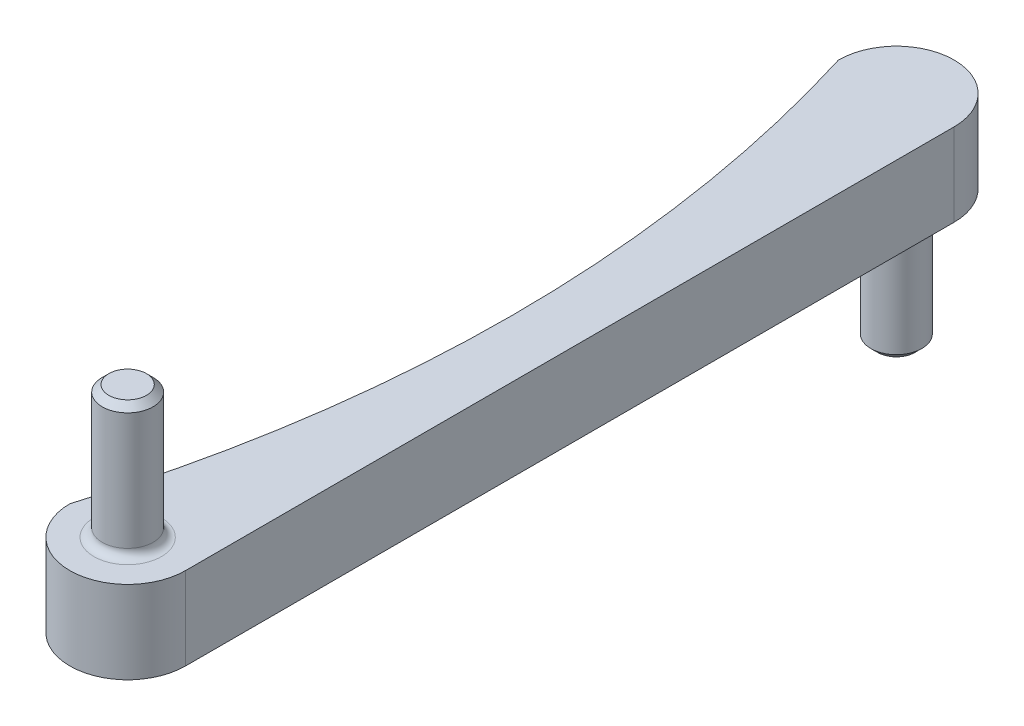
ISO-10303-21;
HEADER;
FILE_DESCRIPTION(('STEP AP214'),'2;1');
FILE_NAME('part.step','',(''),(''),'','','');
FILE_SCHEMA(('AUTOMOTIVE_DESIGN { 1 0 10303 214 1 1 1 1 }'));
ENDSEC;
DATA;
#1=APPLICATION_CONTEXT('core data for automotive mechanical design processes');
#2=APPLICATION_PROTOCOL_DEFINITION('international standard','automotive_design',2000,#1);
#3=PRODUCT_CONTEXT('',#1,'mechanical');
#4=PRODUCT('Part','Part','',(#3));
#5=PRODUCT_RELATED_PRODUCT_CATEGORY('part','',(#4));
#6=PRODUCT_DEFINITION_FORMATION('','',#4);
#7=PRODUCT_DEFINITION_CONTEXT('part definition',#1,'design');
#8=PRODUCT_DEFINITION('design','',#6,#7);
#9=PRODUCT_DEFINITION_SHAPE('','',#8);
#10=(LENGTH_UNIT() NAMED_UNIT(*) SI_UNIT(.MILLI.,.METRE.));
#11=(NAMED_UNIT(*) PLANE_ANGLE_UNIT() SI_UNIT($,.RADIAN.));
#12=(NAMED_UNIT(*) SI_UNIT($,.STERADIAN.) SOLID_ANGLE_UNIT());
#13=UNCERTAINTY_MEASURE_WITH_UNIT(LENGTH_MEASURE(1.E-05),#10,'distance_accuracy_value','');
#14=(GEOMETRIC_REPRESENTATION_CONTEXT(3) GLOBAL_UNCERTAINTY_ASSIGNED_CONTEXT((#13)) GLOBAL_UNIT_ASSIGNED_CONTEXT((#10,
#11,#12)) REPRESENTATION_CONTEXT('',''));
#15=CARTESIAN_POINT('',(0.,0.,0.));
#16=DIRECTION('',(0.,0.,1.));
#17=DIRECTION('',(1.,0.,0.));
#18=AXIS2_PLACEMENT_3D('',#15,#16,#17);
#19=CARTESIAN_POINT('',(0.,6.35,0.));
#20=DIRECTION('',(0.,-1.,0.));
#21=DIRECTION('',(0.,0.,-1.));
#22=AXIS2_PLACEMENT_3D('',#19,#20,#21);
#23=CYLINDRICAL_SURFACE('',#22,4.445);
#24=CARTESIAN_POINT('',(0.,0.,0.));
#25=DIRECTION('',(0.,1.,0.));
#26=DIRECTION('',(0.,0.,1.));
#27=AXIS2_PLACEMENT_3D('',#24,#25,#26);
#28=CIRCLE('',#27,4.445);
#29=CARTESIAN_POINT('',(-4.445,0.,0.));
#30=VERTEX_POINT('',#29);
#31=CARTESIAN_POINT('',(4.445,0.,0.));
#32=VERTEX_POINT('',#31);
#33=EDGE_CURVE('E107',#30,#32,#28,.T.);
#34=ORIENTED_EDGE('',*,*,#33,.T.);
#35=DIRECTION('',(0.,-1.,0.));
#36=VECTOR('',#35,1.);
#37=CARTESIAN_POINT('',(4.445,6.35,0.));
#38=LINE('',#37,#36);
#39=CARTESIAN_POINT('',(4.445,6.35,0.));
#40=VERTEX_POINT('',#39);
#41=EDGE_CURVE('E110',#40,#32,#38,.T.);
#42=ORIENTED_EDGE('',*,*,#41,.F.);
#43=CARTESIAN_POINT('',(0.,6.35,0.));
#44=DIRECTION('',(0.,1.,0.));
#45=DIRECTION('',(0.,0.,1.));
#46=AXIS2_PLACEMENT_3D('',#43,#44,#45);
#47=CIRCLE('',#46,4.445);
#48=CARTESIAN_POINT('',(-4.445,6.35,0.));
#49=VERTEX_POINT('',#48);
#50=EDGE_CURVE('E114',#49,#40,#47,.T.);
#51=ORIENTED_EDGE('',*,*,#50,.F.);
#52=DIRECTION('',(0.,-1.,0.));
#53=VECTOR('',#52,1.);
#54=CARTESIAN_POINT('',(-4.445,6.35,0.));
#55=LINE('',#54,#53);
#56=EDGE_CURVE('E99',#49,#30,#55,.T.);
#57=ORIENTED_EDGE('',*,*,#56,.T.);
#58=EDGE_LOOP('',(#34,#42,#51,#57));
#59=FACE_BOUND('',#58,.T.);
#60=ADVANCED_FACE('F47',(#59),#23,.T.);
#61=CARTESIAN_POINT('',(4.445,6.35,0.));
#62=DIRECTION('',(-1.,0.,0.));
#63=DIRECTION('',(0.,0.,1.));
#64=AXIS2_PLACEMENT_3D('',#61,#62,#63);
#65=PLANE('',#64);
#66=DIRECTION('',(0.,0.,-1.));
#67=VECTOR('',#66,1.);
#68=CARTESIAN_POINT('',(4.445,0.,0.));
#69=LINE('',#68,#67);
#70=CARTESIAN_POINT('',(4.445,0.,-59.055));
#71=VERTEX_POINT('',#70);
#72=EDGE_CURVE('E78',#32,#71,#69,.T.);
#73=ORIENTED_EDGE('',*,*,#72,.T.);
#74=DIRECTION('',(0.,-1.,0.));
#75=VECTOR('',#74,1.);
#76=CARTESIAN_POINT('',(4.445,6.35,-59.055));
#77=LINE('',#76,#75);
#78=CARTESIAN_POINT('',(4.445,6.35,-59.055));
#79=VERTEX_POINT('',#78);
#80=EDGE_CURVE('E98',#79,#71,#77,.T.);
#81=ORIENTED_EDGE('',*,*,#80,.F.);
#82=DIRECTION('',(0.,0.,-1.));
#83=VECTOR('',#82,1.);
#84=CARTESIAN_POINT('',(4.445,6.35,0.));
#85=LINE('',#84,#83);
#86=EDGE_CURVE('E66',#40,#79,#85,.T.);
#87=ORIENTED_EDGE('',*,*,#86,.F.);
#88=ORIENTED_EDGE('',*,*,#41,.T.);
#89=EDGE_LOOP('',(#73,#81,#87,#88));
#90=FACE_BOUND('',#89,.T.);
#91=ADVANCED_FACE('F167',(#90),#65,.F.);
#92=CARTESIAN_POINT('',(0.,6.35,-59.055));
#93=DIRECTION('',(0.,-1.,0.));
#94=DIRECTION('',(0.,0.,-1.));
#95=AXIS2_PLACEMENT_3D('',#92,#93,#94);
#96=CYLINDRICAL_SURFACE('',#95,4.445);
#97=CARTESIAN_POINT('',(0.,0.,-59.055));
#98=DIRECTION('',(0.,1.,0.));
#99=DIRECTION('',(0.,0.,1.));
#100=AXIS2_PLACEMENT_3D('',#97,#98,#99);
#101=CIRCLE('',#100,4.445);
#102=CARTESIAN_POINT('',(-4.445,0.,-59.055));
#103=VERTEX_POINT('',#102);
#104=EDGE_CURVE('E105',#71,#103,#101,.T.);
#105=ORIENTED_EDGE('',*,*,#104,.T.);
#106=DIRECTION('',(0.,-1.,0.));
#107=VECTOR('',#106,1.);
#108=CARTESIAN_POINT('',(-4.445,6.35,-59.055));
#109=LINE('',#108,#107);
#110=CARTESIAN_POINT('',(-4.445,6.35,-59.055));
#111=VERTEX_POINT('',#110);
#112=EDGE_CURVE('E85',#111,#103,#109,.T.);
#113=ORIENTED_EDGE('',*,*,#112,.F.);
#114=CARTESIAN_POINT('',(0.,6.35,-59.055));
#115=DIRECTION('',(0.,1.,0.));
#116=DIRECTION('',(0.,0.,1.));
#117=AXIS2_PLACEMENT_3D('',#114,#115,#116);
#118=CIRCLE('',#117,4.445);
#119=EDGE_CURVE('E123',#79,#111,#118,.T.);
#120=ORIENTED_EDGE('',*,*,#119,.F.);
#121=ORIENTED_EDGE('',*,*,#80,.T.);
#122=EDGE_LOOP('',(#105,#113,#120,#121));
#123=FACE_BOUND('',#122,.T.);
#124=ADVANCED_FACE('F112',(#123),#96,.T.);
#125=CARTESIAN_POINT('',(0.,6.35,0.));
#126=DIRECTION('',(0.,1.,0.));
#127=DIRECTION('',(0.,0.,1.));
#128=AXIS2_PLACEMENT_3D('',#125,#126,#127);
#129=PLANE('',#128);
#130=CARTESIAN_POINT('',(0.,6.35,0.));
#131=DIRECTION('',(0.,1.,0.));
#132=DIRECTION('',(0.,0.,1.));
#133=AXIS2_PLACEMENT_3D('',#130,#131,#132);
#134=CIRCLE('',#133,2.5908);
#135=CARTESIAN_POINT('',(0.,6.35,2.5908));
#136=VERTEX_POINT('',#135);
#137=EDGE_CURVE('E140',#136,#136,#134,.F.);
#138=ORIENTED_EDGE('',*,*,#137,.T.);
#139=EDGE_LOOP('',(#138));
#140=FACE_BOUND('',#139,.T.);
#141=CARTESIAN_POINT('',(-99.9443945089841,6.35,-29.5275));
#142=DIRECTION('',(0.,1.,0.));
#143=DIRECTION('',(0.,0.,-1.));
#144=AXIS2_PLACEMENT_3D('',#141,#142,#143);
#145=CIRCLE('',#144,99.9600300511788);
#146=EDGE_CURVE('E93',#49,#111,#145,.T.);
#147=ORIENTED_EDGE('',*,*,#146,.F.);
#148=ORIENTED_EDGE('',*,*,#50,.T.);
#149=ORIENTED_EDGE('',*,*,#86,.T.);
#150=ORIENTED_EDGE('',*,*,#119,.T.);
#151=EDGE_LOOP('',(#147,#148,#149,#150));
#152=FACE_BOUND('',#151,.T.);
#153=ADVANCED_FACE('F206',(#140,#152),#129,.T.);
#154=CARTESIAN_POINT('',(0.,0.,0.));
#155=DIRECTION('',(0.,1.,0.));
#156=DIRECTION('',(0.,0.,1.));
#157=AXIS2_PLACEMENT_3D('',#154,#155,#156);
#158=PLANE('',#157);
#159=CARTESIAN_POINT('',(0.,0.,-59.055));
#160=DIRECTION('',(0.,1.,0.));
#161=DIRECTION('',(0.,0.,1.));
#162=AXIS2_PLACEMENT_3D('',#159,#160,#161);
#163=CIRCLE('',#162,2.5908);
#164=CARTESIAN_POINT('',(0.,0.,-56.4642));
#165=VERTEX_POINT('',#164);
#166=EDGE_CURVE('E132',#165,#165,#163,.T.);
#167=ORIENTED_EDGE('',*,*,#166,.T.);
#168=EDGE_LOOP('',(#167));
#169=FACE_BOUND('',#168,.T.);
#170=ORIENTED_EDGE('',*,*,#33,.F.);
#171=CARTESIAN_POINT('',(-99.9443945089841,0.,-29.5275));
#172=DIRECTION('',(0.,1.,0.));
#173=DIRECTION('',(0.,0.,1.));
#174=AXIS2_PLACEMENT_3D('',#171,#172,#173);
#175=CIRCLE('',#174,99.9600300511788);
#176=EDGE_CURVE('E89',#30,#103,#175,.T.);
#177=ORIENTED_EDGE('',*,*,#176,.T.);
#178=ORIENTED_EDGE('',*,*,#104,.F.);
#179=ORIENTED_EDGE('',*,*,#72,.F.);
#180=EDGE_LOOP('',(#170,#177,#178,#179));
#181=FACE_BOUND('',#180,.T.);
#182=ADVANCED_FACE('F104',(#169,#181),#158,.F.);
#183=CARTESIAN_POINT('',(0.,16.51,0.));
#184=DIRECTION('',(0.,-1.,0.));
#185=DIRECTION('',(0.,0.,-1.));
#186=AXIS2_PLACEMENT_3D('',#183,#184,#185);
#187=CYLINDRICAL_SURFACE('',#186,1.9558);
#188=CARTESIAN_POINT('',(0.,16.002,0.));
#189=DIRECTION('',(0.,1.,0.));
#190=DIRECTION('',(0.,0.,1.));
#191=AXIS2_PLACEMENT_3D('',#188,#189,#190);
#192=CIRCLE('',#191,1.9558);
#193=CARTESIAN_POINT('',(0.,16.002,1.9558));
#194=VERTEX_POINT('',#193);
#195=EDGE_CURVE('E148',#194,#194,#192,.F.);
#196=ORIENTED_EDGE('',*,*,#195,.T.);
#197=EDGE_LOOP('',(#196));
#198=FACE_BOUND('',#197,.T.);
#199=CARTESIAN_POINT('',(0.,6.985,0.));
#200=DIRECTION('',(0.,1.,0.));
#201=DIRECTION('',(0.,0.,1.));
#202=AXIS2_PLACEMENT_3D('',#199,#200,#201);
#203=CIRCLE('',#202,1.9558);
#204=CARTESIAN_POINT('',(0.,6.985,1.9558));
#205=VERTEX_POINT('',#204);
#206=EDGE_CURVE('E136',#205,#205,#203,.T.);
#207=ORIENTED_EDGE('',*,*,#206,.T.);
#208=EDGE_LOOP('',(#207));
#209=FACE_BOUND('',#208,.T.);
#210=ADVANCED_FACE('F195',(#198,#209),#187,.T.);
#211=CARTESIAN_POINT('',(0.,16.51,0.));
#212=DIRECTION('',(0.,1.,0.));
#213=DIRECTION('',(0.,0.,1.));
#214=AXIS2_PLACEMENT_3D('',#211,#212,#213);
#215=PLANE('',#214);
#216=CARTESIAN_POINT('',(0.,16.51,0.));
#217=DIRECTION('',(0.,1.,0.));
#218=DIRECTION('',(0.,0.,1.));
#219=AXIS2_PLACEMENT_3D('',#216,#217,#218);
#220=CIRCLE('',#219,1.4478);
#221=CARTESIAN_POINT('',(0.,16.51,1.4478));
#222=VERTEX_POINT('',#221);
#223=EDGE_CURVE('E144',#222,#222,#220,.T.);
#224=ORIENTED_EDGE('',*,*,#223,.T.);
#225=EDGE_LOOP('',(#224));
#226=FACE_BOUND('',#225,.T.);
#227=ADVANCED_FACE('F196',(#226),#215,.T.);
#228=CARTESIAN_POINT('',(0.,-10.16,-59.055));
#229=DIRECTION('',(0.,1.,0.));
#230=DIRECTION('',(0.,0.,1.));
#231=AXIS2_PLACEMENT_3D('',#228,#229,#230);
#232=CYLINDRICAL_SURFACE('',#231,1.9558);
#233=CARTESIAN_POINT('',(0.,-9.652,-59.055));
#234=DIRECTION('',(0.,-1.,0.));
#235=DIRECTION('',(0.,0.,-1.));
#236=AXIS2_PLACEMENT_3D('',#233,#234,#235);
#237=CIRCLE('',#236,1.9558);
#238=CARTESIAN_POINT('',(0.,-9.652,-61.0108));
#239=VERTEX_POINT('',#238);
#240=EDGE_CURVE('E11',#239,#239,#237,.F.);
#241=ORIENTED_EDGE('',*,*,#240,.T.);
#242=EDGE_LOOP('',(#241));
#243=FACE_BOUND('',#242,.T.);
#244=CARTESIAN_POINT('',(0.,-0.635,-59.055));
#245=DIRECTION('',(0.,1.,0.));
#246=DIRECTION('',(0.,0.,1.));
#247=AXIS2_PLACEMENT_3D('',#244,#245,#246);
#248=CIRCLE('',#247,1.9558);
#249=CARTESIAN_POINT('',(0.,-0.635,-57.0992));
#250=VERTEX_POINT('',#249);
#251=EDGE_CURVE('E109',#250,#250,#248,.F.);
#252=ORIENTED_EDGE('',*,*,#251,.T.);
#253=EDGE_LOOP('',(#252));
#254=FACE_BOUND('',#253,.T.);
#255=ADVANCED_FACE('F202',(#243,#254),#232,.T.);
#256=CARTESIAN_POINT('',(0.,-10.16,-59.055));
#257=DIRECTION('',(0.,-1.,0.));
#258=DIRECTION('',(0.,0.,-1.));
#259=AXIS2_PLACEMENT_3D('',#256,#257,#258);
#260=PLANE('',#259);
#261=CARTESIAN_POINT('',(0.,-10.16,-59.055));
#262=DIRECTION('',(0.,-1.,0.));
#263=DIRECTION('',(0.,0.,-1.));
#264=AXIS2_PLACEMENT_3D('',#261,#262,#263);
#265=CIRCLE('',#264,1.44779999999999);
#266=CARTESIAN_POINT('',(0.,-10.16,-60.5028));
#267=VERTEX_POINT('',#266);
#268=EDGE_CURVE('E58',#267,#267,#265,.T.);
#269=ORIENTED_EDGE('',*,*,#268,.T.);
#270=EDGE_LOOP('',(#269));
#271=FACE_BOUND('',#270,.T.);
#272=ADVANCED_FACE('F155',(#271),#260,.T.);
#273=CARTESIAN_POINT('',(-99.9443945089841,-10.16,-29.5275));
#274=DIRECTION('',(0.,1.,0.));
#275=DIRECTION('',(0.,0.,1.));
#276=AXIS2_PLACEMENT_3D('',#273,#274,#275);
#277=CYLINDRICAL_SURFACE('',#276,99.9600300511788);
#278=ORIENTED_EDGE('',*,*,#56,.F.);
#279=ORIENTED_EDGE('',*,*,#146,.T.);
#280=ORIENTED_EDGE('',*,*,#112,.T.);
#281=ORIENTED_EDGE('',*,*,#176,.F.);
#282=EDGE_LOOP('',(#278,#279,#280,#281));
#283=FACE_BOUND('',#282,.T.);
#284=ADVANCED_FACE('F88',(#283),#277,.F.);
#285=CARTESIAN_POINT('',(0.,-0.635,-59.055));
#286=DIRECTION('',(0.,1.,0.));
#287=DIRECTION('',(0.,0.,1.));
#288=AXIS2_PLACEMENT_3D('',#285,#286,#287);
#289=TOROIDAL_SURFACE('',#288,2.5908,0.635);
#290=ORIENTED_EDGE('',*,*,#166,.F.);
#291=EDGE_LOOP('',(#290));
#292=FACE_BOUND('',#291,.T.);
#293=ORIENTED_EDGE('',*,*,#251,.F.);
#294=EDGE_LOOP('',(#293));
#295=FACE_BOUND('',#294,.T.);
#296=ADVANCED_FACE('F177',(#292,#295),#289,.F.);
#297=CARTESIAN_POINT('',(0.,6.985,0.));
#298=DIRECTION('',(0.,1.,0.));
#299=DIRECTION('',(0.,0.,1.));
#300=AXIS2_PLACEMENT_3D('',#297,#298,#299);
#301=TOROIDAL_SURFACE('',#300,2.5908,0.635);
#302=ORIENTED_EDGE('',*,*,#137,.F.);
#303=EDGE_LOOP('',(#302));
#304=FACE_BOUND('',#303,.T.);
#305=ORIENTED_EDGE('',*,*,#206,.F.);
#306=EDGE_LOOP('',(#305));
#307=FACE_BOUND('',#306,.T.);
#308=ADVANCED_FACE('F163',(#304,#307),#301,.F.);
#309=CARTESIAN_POINT('',(0.,16.51,0.));
#310=DIRECTION('',(0.,-1.,0.));
#311=DIRECTION('',(0.,0.,-1.));
#312=AXIS2_PLACEMENT_3D('',#309,#310,#311);
#313=CONICAL_SURFACE('',#312,1.4478,0.785398163397441);
#314=ORIENTED_EDGE('',*,*,#195,.F.);
#315=EDGE_LOOP('',(#314));
#316=FACE_BOUND('',#315,.T.);
#317=ORIENTED_EDGE('',*,*,#223,.F.);
#318=EDGE_LOOP('',(#317));
#319=FACE_BOUND('',#318,.T.);
#320=ADVANCED_FACE('F158',(#316,#319),#313,.T.);
#321=CARTESIAN_POINT('',(0.,-10.16,-59.055));
#322=DIRECTION('',(0.,1.,0.));
#323=DIRECTION('',(0.,0.,1.));
#324=AXIS2_PLACEMENT_3D('',#321,#322,#323);
#325=CONICAL_SURFACE('',#324,1.44779999999999,0.785398163397454);
#326=ORIENTED_EDGE('',*,*,#240,.F.);
#327=EDGE_LOOP('',(#326));
#328=FACE_BOUND('',#327,.T.);
#329=ORIENTED_EDGE('',*,*,#268,.F.);
#330=EDGE_LOOP('',(#329));
#331=FACE_BOUND('',#330,.T.);
#332=ADVANCED_FACE('F50',(#328,#331),#325,.T.);
#333=CLOSED_SHELL('',(#60,#91,#124,#153,#182,#210,#227,#255,#272,#284,#296,#308,#320,#332));
#334=MANIFOLD_SOLID_BREP('B2',#333);
#335=ADVANCED_BREP_SHAPE_REPRESENTATION('',(#18,#334),#14);
#336=SHAPE_DEFINITION_REPRESENTATION(#9,#335);
ENDSEC;
END-ISO-10303-21;
